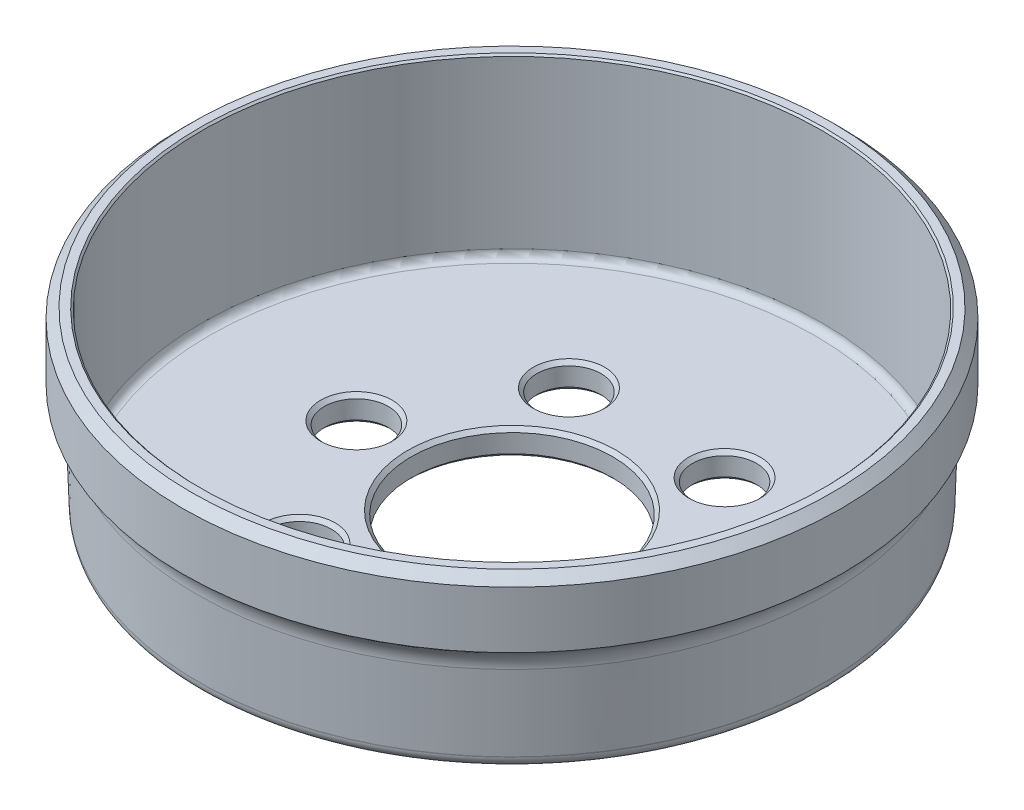
ISO-10303-21;
HEADER;
FILE_DESCRIPTION(('STEP AP214'),'2;1');
FILE_NAME('part.step','',(''),(''),'','','');
FILE_SCHEMA(('AUTOMOTIVE_DESIGN { 1 0 10303 214 1 1 1 1 }'));
ENDSEC;
DATA;
#1=APPLICATION_CONTEXT('core data for automotive mechanical design processes');
#2=APPLICATION_PROTOCOL_DEFINITION('international standard','automotive_design',2000,#1);
#3=PRODUCT_CONTEXT('',#1,'mechanical');
#4=PRODUCT('Part','Part','',(#3));
#5=PRODUCT_RELATED_PRODUCT_CATEGORY('part','',(#4));
#6=PRODUCT_DEFINITION_FORMATION('','',#4);
#7=PRODUCT_DEFINITION_CONTEXT('part definition',#1,'design');
#8=PRODUCT_DEFINITION('design','',#6,#7);
#9=PRODUCT_DEFINITION_SHAPE('','',#8);
#10=(LENGTH_UNIT() NAMED_UNIT(*) SI_UNIT(.MILLI.,.METRE.));
#11=(NAMED_UNIT(*) PLANE_ANGLE_UNIT() SI_UNIT($,.RADIAN.));
#12=(NAMED_UNIT(*) SI_UNIT($,.STERADIAN.) SOLID_ANGLE_UNIT());
#13=UNCERTAINTY_MEASURE_WITH_UNIT(LENGTH_MEASURE(1.E-05),#10,'distance_accuracy_value','');
#14=(GEOMETRIC_REPRESENTATION_CONTEXT(3) GLOBAL_UNCERTAINTY_ASSIGNED_CONTEXT((#13)) GLOBAL_UNIT_ASSIGNED_CONTEXT((#10,
#11,#12)) REPRESENTATION_CONTEXT('',''));
#15=CARTESIAN_POINT('',(0.,0.,0.));
#16=DIRECTION('',(0.,0.,1.));
#17=DIRECTION('',(1.,0.,0.));
#18=AXIS2_PLACEMENT_3D('',#15,#16,#17);
#19=CARTESIAN_POINT('',(0.,0.,0.));
#20=DIRECTION('',(0.,-1.,0.));
#21=DIRECTION('',(0.,0.,-1.));
#22=AXIS2_PLACEMENT_3D('',#19,#20,#21);
#23=CYLINDRICAL_SURFACE('',#22,16.948);
#24=CARTESIAN_POINT('',(0.,-0.1,0.));
#25=DIRECTION('',(0.,-1.,0.));
#26=DIRECTION('',(0.,0.,-1.));
#27=AXIS2_PLACEMENT_3D('',#24,#25,#26);
#28=CIRCLE('',#27,16.948);
#29=CARTESIAN_POINT('',(0.,-0.1,-16.948));
#30=VERTEX_POINT('',#29);
#31=EDGE_CURVE('E28',#30,#30,#28,.T.);
#32=ORIENTED_EDGE('',*,*,#31,.F.);
#33=EDGE_LOOP('',(#32));
#34=FACE_BOUND('',#33,.T.);
#35=CARTESIAN_POINT('',(0.,-9.2,0.));
#36=DIRECTION('',(0.,-1.,0.));
#37=DIRECTION('',(0.,0.,-1.));
#38=AXIS2_PLACEMENT_3D('',#35,#36,#37);
#39=CIRCLE('',#38,16.948);
#40=CARTESIAN_POINT('',(0.,-9.2,-16.948));
#41=VERTEX_POINT('',#40);
#42=EDGE_CURVE('E11',#41,#41,#39,.T.);
#43=ORIENTED_EDGE('',*,*,#42,.T.);
#44=EDGE_LOOP('',(#43));
#45=FACE_BOUND('',#44,.T.);
#46=ADVANCED_FACE('F17',(#34,#45),#23,.F.);
#47=CARTESIAN_POINT('',(0.,-0.1,0.));
#48=DIRECTION('',(0.,1.,0.));
#49=DIRECTION('',(0.,0.,1.));
#50=AXIS2_PLACEMENT_3D('',#47,#48,#49);
#51=CONICAL_SURFACE('',#50,16.948,0.785398163397448);
#52=CARTESIAN_POINT('',(0.,0.,0.));
#53=DIRECTION('',(0.,-1.,0.));
#54=DIRECTION('',(0.,0.,-1.));
#55=AXIS2_PLACEMENT_3D('',#52,#53,#54);
#56=CIRCLE('',#55,17.048);
#57=CARTESIAN_POINT('',(0.,0.,-17.048));
#58=VERTEX_POINT('',#57);
#59=EDGE_CURVE('E324',#58,#58,#56,.T.);
#60=ORIENTED_EDGE('',*,*,#59,.F.);
#61=EDGE_LOOP('',(#60));
#62=FACE_BOUND('',#61,.T.);
#63=ORIENTED_EDGE('',*,*,#31,.T.);
#64=EDGE_LOOP('',(#63));
#65=FACE_BOUND('',#64,.T.);
#66=ADVANCED_FACE('F331',(#62,#65),#51,.F.);
#67=CARTESIAN_POINT('',(17.048,0.,0.));
#68=DIRECTION('',(0.,-1.,0.));
#69=DIRECTION('',(0.,0.,-1.));
#70=AXIS2_PLACEMENT_3D('',#67,#68,#69);
#71=PLANE('',#70);
#72=CARTESIAN_POINT('',(0.,0.,0.));
#73=DIRECTION('',(0.,-1.,0.));
#74=DIRECTION('',(0.,0.,-1.));
#75=AXIS2_PLACEMENT_3D('',#72,#73,#74);
#76=CIRCLE('',#75,17.5);
#77=CARTESIAN_POINT('',(0.,0.,-17.5));
#78=VERTEX_POINT('',#77);
#79=EDGE_CURVE('E320',#78,#78,#76,.T.);
#80=ORIENTED_EDGE('',*,*,#79,.F.);
#81=EDGE_LOOP('',(#80));
#82=FACE_BOUND('',#81,.T.);
#83=ORIENTED_EDGE('',*,*,#59,.T.);
#84=EDGE_LOOP('',(#83));
#85=FACE_BOUND('',#84,.T.);
#86=ADVANCED_FACE('F333',(#82,#85),#71,.F.);
#87=CARTESIAN_POINT('',(0.,0.,0.));
#88=DIRECTION('',(0.,-1.,0.));
#89=DIRECTION('',(0.,0.,-1.));
#90=AXIS2_PLACEMENT_3D('',#87,#88,#89);
#91=CONICAL_SURFACE('',#90,17.5,0.785398163397442);
#92=CARTESIAN_POINT('',(0.,-0.5,0.));
#93=DIRECTION('',(0.,-1.,0.));
#94=DIRECTION('',(0.,0.,-1.));
#95=AXIS2_PLACEMENT_3D('',#92,#93,#94);
#96=CIRCLE('',#95,18.);
#97=CARTESIAN_POINT('',(0.,-0.5,-18.));
#98=VERTEX_POINT('',#97);
#99=EDGE_CURVE('E316',#98,#98,#96,.T.);
#100=ORIENTED_EDGE('',*,*,#99,.F.);
#101=EDGE_LOOP('',(#100));
#102=FACE_BOUND('',#101,.T.);
#103=ORIENTED_EDGE('',*,*,#79,.T.);
#104=EDGE_LOOP('',(#103));
#105=FACE_BOUND('',#104,.T.);
#106=ADVANCED_FACE('F341',(#102,#105),#91,.T.);
#107=CARTESIAN_POINT('',(0.,0.,0.));
#108=DIRECTION('',(0.,-1.,0.));
#109=DIRECTION('',(0.,0.,-1.));
#110=AXIS2_PLACEMENT_3D('',#107,#108,#109);
#111=CYLINDRICAL_SURFACE('',#110,18.);
#112=CARTESIAN_POINT('',(0.,-3.6,0.));
#113=DIRECTION('',(0.,-1.,0.));
#114=DIRECTION('',(0.,0.,-1.));
#115=AXIS2_PLACEMENT_3D('',#112,#113,#114);
#116=CIRCLE('',#115,18.);
#117=CARTESIAN_POINT('',(0.,-3.6,-18.));
#118=VERTEX_POINT('',#117);
#119=EDGE_CURVE('E312',#118,#118,#116,.T.);
#120=ORIENTED_EDGE('',*,*,#119,.F.);
#121=EDGE_LOOP('',(#120));
#122=FACE_BOUND('',#121,.T.);
#123=ORIENTED_EDGE('',*,*,#99,.T.);
#124=EDGE_LOOP('',(#123));
#125=FACE_BOUND('',#124,.T.);
#126=ADVANCED_FACE('F348',(#122,#125),#111,.T.);
#127=CARTESIAN_POINT('',(0.,-4.89961620758618,0.));
#128=DIRECTION('',(0.,-1.,0.));
#129=DIRECTION('',(0.,0.,-1.));
#130=AXIS2_PLACEMENT_3D('',#127,#128,#129);
#131=TOROIDAL_SURFACE('',#130,18.748997805724,1.5);
#132=CARTESIAN_POINT('',(0.,-4.92553676793566,0.));
#133=DIRECTION('',(0.,-1.,0.));
#134=DIRECTION('',(0.,0.,-1.));
#135=AXIS2_PLACEMENT_3D('',#132,#133,#134);
#136=CIRCLE('',#135,17.2492217809285);
#137=CARTESIAN_POINT('',(0.,-4.92553676793566,-17.2492217809285));
#138=VERTEX_POINT('',#137);
#139=EDGE_CURVE('E308',#138,#138,#136,.T.);
#140=ORIENTED_EDGE('',*,*,#139,.F.);
#141=EDGE_LOOP('',(#140));
#142=FACE_BOUND('',#141,.T.);
#143=ORIENTED_EDGE('',*,*,#119,.T.);
#144=EDGE_LOOP('',(#143));
#145=FACE_BOUND('',#144,.T.);
#146=ADVANCED_FACE('F352',(#142,#145),#131,.F.);
#147=CARTESIAN_POINT('',(0.,-4.92553676793566,0.));
#148=DIRECTION('',(0.,1.,0.));
#149=DIRECTION('',(0.,0.,1.));
#150=AXIS2_PLACEMENT_3D('',#147,#148,#149);
#151=CONICAL_SURFACE('',#150,17.2492217809285,0.0333329175489645);
#152=CARTESIAN_POINT('',(0.,-9.16053288232279,0.));
#153=DIRECTION('',(0.,-1.,0.));
#154=DIRECTION('',(0.,0.,-1.));
#155=AXIS2_PLACEMENT_3D('',#152,#153,#154);
#156=CIRCLE('',#155,17.108004699435);
#157=CARTESIAN_POINT('',(0.,-9.16053288232279,-17.108004699435));
#158=VERTEX_POINT('',#157);
#159=EDGE_CURVE('E304',#158,#158,#156,.T.);
#160=ORIENTED_EDGE('',*,*,#159,.F.);
#161=EDGE_LOOP('',(#160));
#162=FACE_BOUND('',#161,.T.);
#163=ORIENTED_EDGE('',*,*,#139,.T.);
#164=EDGE_LOOP('',(#163));
#165=FACE_BOUND('',#164,.T.);
#166=ADVANCED_FACE('F356',(#162,#165),#151,.T.);
#167=CARTESIAN_POINT('',(0.,0.,0.));
#168=DIRECTION('',(0.,-1.,0.));
#169=DIRECTION('',(0.,0.,-1.));
#170=AXIS2_PLACEMENT_3D('',#167,#168,#169);
#171=CYLINDRICAL_SURFACE('',#170,17.108004699435);
#172=CARTESIAN_POINT('',(0.,-9.18,0.));
#173=DIRECTION('',(0.,-1.,0.));
#174=DIRECTION('',(0.,0.,-1.));
#175=AXIS2_PLACEMENT_3D('',#172,#173,#174);
#176=CIRCLE('',#175,17.108004699435);
#177=CARTESIAN_POINT('',(0.,-9.18,-17.108004699435));
#178=VERTEX_POINT('',#177);
#179=EDGE_CURVE('E300',#178,#178,#176,.T.);
#180=ORIENTED_EDGE('',*,*,#179,.F.);
#181=EDGE_LOOP('',(#180));
#182=FACE_BOUND('',#181,.T.);
#183=ORIENTED_EDGE('',*,*,#159,.T.);
#184=EDGE_LOOP('',(#183));
#185=FACE_BOUND('',#184,.T.);
#186=ADVANCED_FACE('F360',(#182,#185),#171,.T.);
#187=CARTESIAN_POINT('',(0.,-9.18,0.));
#188=DIRECTION('',(0.,-1.,0.));
#189=DIRECTION('',(0.,0.,-1.));
#190=AXIS2_PLACEMENT_3D('',#187,#188,#189);
#191=TOROIDAL_SURFACE('',#190,16.508004699435,0.6);
#192=CARTESIAN_POINT('',(0.,-9.77913544998665,0.));
#193=DIRECTION('',(0.,-1.,0.));
#194=DIRECTION('',(0.,0.,-1.));
#195=AXIS2_PLACEMENT_3D('',#192,#193,#194);
#196=CIRCLE('',#195,16.5402027206363);
#197=CARTESIAN_POINT('',(0.,-9.77913544998665,-16.5402027206363));
#198=VERTEX_POINT('',#197);
#199=EDGE_CURVE('E296',#198,#198,#196,.T.);
#200=ORIENTED_EDGE('',*,*,#199,.F.);
#201=EDGE_LOOP('',(#200));
#202=FACE_BOUND('',#201,.T.);
#203=ORIENTED_EDGE('',*,*,#179,.T.);
#204=EDGE_LOOP('',(#203));
#205=FACE_BOUND('',#204,.T.);
#206=ADVANCED_FACE('F364',(#202,#205),#191,.T.);
#207=CARTESIAN_POINT('',(0.,-9.77913544998665,0.));
#208=DIRECTION('',(0.,1.,0.));
#209=DIRECTION('',(0.,0.,1.));
#210=AXIS2_PLACEMENT_3D('',#207,#208,#209);
#211=CONICAL_SURFACE('',#210,16.5402027206363,1.51710716844671);
#212=CARTESIAN_POINT('',(0.,-10.0398286215847,0.));
#213=DIRECTION('',(0.,-1.,0.));
#214=DIRECTION('',(0.,0.,-1.));
#215=AXIS2_PLACEMENT_3D('',#212,#213,#214);
#216=CIRCLE('',#215,11.6892673262663);
#217=CARTESIAN_POINT('',(0.,-10.0398286215847,-11.6892673262663));
#218=VERTEX_POINT('',#217);
#219=EDGE_CURVE('E292',#218,#218,#216,.T.);
#220=ORIENTED_EDGE('',*,*,#219,.F.);
#221=EDGE_LOOP('',(#220));
#222=FACE_BOUND('',#221,.T.);
#223=ORIENTED_EDGE('',*,*,#199,.T.);
#224=EDGE_LOOP('',(#223));
#225=FACE_BOUND('',#224,.T.);
#226=ADVANCED_FACE('F368',(#222,#225),#211,.T.);
#227=CARTESIAN_POINT('',(0.,-10.2395404382469,0.));
#228=DIRECTION('',(0.,-1.,0.));
#229=DIRECTION('',(0.,0.,-1.));
#230=AXIS2_PLACEMENT_3D('',#227,#228,#229);
#231=TOROIDAL_SURFACE('',#230,11.7,0.2);
#232=CARTESIAN_POINT('',(0.,-10.2395404382469,0.));
#233=DIRECTION('',(0.,-1.,0.));
#234=DIRECTION('',(0.,0.,-1.));
#235=AXIS2_PLACEMENT_3D('',#232,#233,#234);
#236=CIRCLE('',#235,11.5);
#237=CARTESIAN_POINT('',(0.,-10.2395404382469,-11.5));
#238=VERTEX_POINT('',#237);
#239=EDGE_CURVE('E288',#238,#238,#236,.T.);
#240=ORIENTED_EDGE('',*,*,#239,.F.);
#241=EDGE_LOOP('',(#240));
#242=FACE_BOUND('',#241,.T.);
#243=ORIENTED_EDGE('',*,*,#219,.T.);
#244=EDGE_LOOP('',(#243));
#245=FACE_BOUND('',#244,.T.);
#246=ADVANCED_FACE('F372',(#242,#245),#231,.F.);
#247=CARTESIAN_POINT('',(0.,0.,0.));
#248=DIRECTION('',(0.,-1.,0.));
#249=DIRECTION('',(0.,0.,-1.));
#250=AXIS2_PLACEMENT_3D('',#247,#248,#249);
#251=CYLINDRICAL_SURFACE('',#250,11.5);
#252=CARTESIAN_POINT('',(0.,-10.8,0.));
#253=DIRECTION('',(0.,-1.,0.));
#254=DIRECTION('',(0.,0.,-1.));
#255=AXIS2_PLACEMENT_3D('',#252,#253,#254);
#256=CIRCLE('',#255,11.5);
#257=CARTESIAN_POINT('',(0.,-10.8,-11.5));
#258=VERTEX_POINT('',#257);
#259=EDGE_CURVE('E281',#258,#258,#256,.T.);
#260=ORIENTED_EDGE('',*,*,#259,.F.);
#261=EDGE_LOOP('',(#260));
#262=FACE_BOUND('',#261,.T.);
#263=ORIENTED_EDGE('',*,*,#239,.T.);
#264=EDGE_LOOP('',(#263));
#265=FACE_BOUND('',#264,.T.);
#266=ADVANCED_FACE('F376',(#262,#265),#251,.T.);
#267=CARTESIAN_POINT('',(0.,-10.8,0.));
#268=DIRECTION('',(0.,1.,0.));
#269=DIRECTION('',(0.,0.,1.));
#270=AXIS2_PLACEMENT_3D('',#267,#268,#269);
#271=CONICAL_SURFACE('',#270,11.5,0.785398163397448);
#272=CARTESIAN_POINT('',(0.,-11.,0.));
#273=DIRECTION('',(0.,-1.,0.));
#274=DIRECTION('',(0.,0.,-1.));
#275=AXIS2_PLACEMENT_3D('',#272,#273,#274);
#276=CIRCLE('',#275,11.3);
#277=CARTESIAN_POINT('',(0.,-11.,-11.3));
#278=VERTEX_POINT('',#277);
#279=EDGE_CURVE('E256',#278,#278,#276,.T.);
#280=ORIENTED_EDGE('',*,*,#279,.F.);
#281=EDGE_LOOP('',(#280));
#282=FACE_BOUND('',#281,.T.);
#283=ORIENTED_EDGE('',*,*,#259,.T.);
#284=EDGE_LOOP('',(#283));
#285=FACE_BOUND('',#284,.T.);
#286=ADVANCED_FACE('F380',(#282,#285),#271,.T.);
#287=CARTESIAN_POINT('',(11.3,-11.,0.));
#288=DIRECTION('',(0.,1.,0.));
#289=DIRECTION('',(0.,0.,1.));
#290=AXIS2_PLACEMENT_3D('',#287,#288,#289);
#291=PLANE('',#290);
#292=CARTESIAN_POINT('',(4.25,-11.,7.36121593216775));
#293=DIRECTION('',(0.,1.,0.));
#294=DIRECTION('',(0.,0.,1.));
#295=AXIS2_PLACEMENT_3D('',#292,#293,#294);
#296=CIRCLE('',#295,1.95);
#297=CARTESIAN_POINT('',(4.25,-11.,9.31121593216775));
#298=VERTEX_POINT('',#297);
#299=EDGE_CURVE('E277',#298,#298,#296,.T.);
#300=ORIENTED_EDGE('',*,*,#299,.T.);
#301=EDGE_LOOP('',(#300));
#302=FACE_BOUND('',#301,.T.);
#303=CARTESIAN_POINT('',(-4.25,-11.,7.36121593216772));
#304=DIRECTION('',(0.,1.,0.));
#305=DIRECTION('',(0.,0.,1.));
#306=AXIS2_PLACEMENT_3D('',#303,#304,#305);
#307=CIRCLE('',#306,1.95);
#308=CARTESIAN_POINT('',(-4.25,-11.,9.31121593216772));
#309=VERTEX_POINT('',#308);
#310=EDGE_CURVE('E273',#309,#309,#307,.T.);
#311=ORIENTED_EDGE('',*,*,#310,.T.);
#312=EDGE_LOOP('',(#311));
#313=FACE_BOUND('',#312,.T.);
#314=CARTESIAN_POINT('',(-8.5,-11.,0.));
#315=DIRECTION('',(0.,1.,0.));
#316=DIRECTION('',(0.,0.,1.));
#317=AXIS2_PLACEMENT_3D('',#314,#315,#316);
#318=CIRCLE('',#317,1.95);
#319=CARTESIAN_POINT('',(-8.5,-11.,1.95));
#320=VERTEX_POINT('',#319);
#321=EDGE_CURVE('E269',#320,#320,#318,.T.);
#322=ORIENTED_EDGE('',*,*,#321,.T.);
#323=EDGE_LOOP('',(#322));
#324=FACE_BOUND('',#323,.T.);
#325=CARTESIAN_POINT('',(-4.25,-11.,-7.36121593216773));
#326=DIRECTION('',(0.,1.,0.));
#327=DIRECTION('',(0.,0.,1.));
#328=AXIS2_PLACEMENT_3D('',#325,#326,#327);
#329=CIRCLE('',#328,1.95);
#330=CARTESIAN_POINT('',(-4.25,-11.,-5.41121593216773));
#331=VERTEX_POINT('',#330);
#332=EDGE_CURVE('E265',#331,#331,#329,.T.);
#333=ORIENTED_EDGE('',*,*,#332,.T.);
#334=EDGE_LOOP('',(#333));
#335=FACE_BOUND('',#334,.T.);
#336=CARTESIAN_POINT('',(4.25,-11.,-7.36121593216772));
#337=DIRECTION('',(0.,1.,0.));
#338=DIRECTION('',(0.,0.,1.));
#339=AXIS2_PLACEMENT_3D('',#336,#337,#338);
#340=CIRCLE('',#339,1.95);
#341=CARTESIAN_POINT('',(4.25,-11.,-5.41121593216772));
#342=VERTEX_POINT('',#341);
#343=EDGE_CURVE('E261',#342,#342,#340,.T.);
#344=ORIENTED_EDGE('',*,*,#343,.T.);
#345=EDGE_LOOP('',(#344));
#346=FACE_BOUND('',#345,.T.);
#347=CARTESIAN_POINT('',(8.5,-11.,0.));
#348=DIRECTION('',(0.,1.,0.));
#349=DIRECTION('',(0.,0.,1.));
#350=AXIS2_PLACEMENT_3D('',#347,#348,#349);
#351=CIRCLE('',#350,1.95);
#352=CARTESIAN_POINT('',(8.5,-11.,1.95));
#353=VERTEX_POINT('',#352);
#354=EDGE_CURVE('E257',#353,#353,#351,.T.);
#355=ORIENTED_EDGE('',*,*,#354,.T.);
#356=EDGE_LOOP('',(#355));
#357=FACE_BOUND('',#356,.T.);
#358=CARTESIAN_POINT('',(0.,-11.,0.));
#359=DIRECTION('',(0.,-1.,0.));
#360=DIRECTION('',(0.,0.,-1.));
#361=AXIS2_PLACEMENT_3D('',#358,#359,#360);
#362=CIRCLE('',#361,5.7);
#363=CARTESIAN_POINT('',(0.,-11.,-5.7));
#364=VERTEX_POINT('',#363);
#365=EDGE_CURVE('E252',#364,#364,#362,.T.);
#366=ORIENTED_EDGE('',*,*,#365,.F.);
#367=EDGE_LOOP('',(#366));
#368=FACE_BOUND('',#367,.T.);
#369=ORIENTED_EDGE('',*,*,#279,.T.);
#370=EDGE_LOOP('',(#369));
#371=FACE_BOUND('',#370,.T.);
#372=ADVANCED_FACE('F384',(#302,#313,#324,#335,#346,#357,#368,#371),#291,.F.);
#373=CARTESIAN_POINT('',(0.,-11.,0.));
#374=DIRECTION('',(0.,-1.,0.));
#375=DIRECTION('',(0.,0.,-1.));
#376=AXIS2_PLACEMENT_3D('',#373,#374,#375);
#377=CONICAL_SURFACE('',#376,5.7,0.78539816339745);
#378=CARTESIAN_POINT('',(0.,-10.8,0.));
#379=DIRECTION('',(0.,-1.,0.));
#380=DIRECTION('',(0.,0.,-1.));
#381=AXIS2_PLACEMENT_3D('',#378,#379,#380);
#382=CIRCLE('',#381,5.5);
#383=CARTESIAN_POINT('',(0.,-10.8,-5.5));
#384=VERTEX_POINT('',#383);
#385=EDGE_CURVE('E248',#384,#384,#382,.T.);
#386=ORIENTED_EDGE('',*,*,#385,.F.);
#387=EDGE_LOOP('',(#386));
#388=FACE_BOUND('',#387,.T.);
#389=ORIENTED_EDGE('',*,*,#365,.T.);
#390=EDGE_LOOP('',(#389));
#391=FACE_BOUND('',#390,.T.);
#392=ADVANCED_FACE('F388',(#388,#391),#377,.F.);
#393=CARTESIAN_POINT('',(0.,0.,0.));
#394=DIRECTION('',(0.,-1.,0.));
#395=DIRECTION('',(0.,0.,-1.));
#396=AXIS2_PLACEMENT_3D('',#393,#394,#395);
#397=CYLINDRICAL_SURFACE('',#396,5.5);
#398=CARTESIAN_POINT('',(0.,-9.8,0.));
#399=DIRECTION('',(0.,-1.,0.));
#400=DIRECTION('',(0.,0.,-1.));
#401=AXIS2_PLACEMENT_3D('',#398,#399,#400);
#402=CIRCLE('',#401,5.5);
#403=CARTESIAN_POINT('',(0.,-9.8,-5.5));
#404=VERTEX_POINT('',#403);
#405=EDGE_CURVE('E241',#404,#404,#402,.T.);
#406=ORIENTED_EDGE('',*,*,#405,.F.);
#407=EDGE_LOOP('',(#406));
#408=FACE_BOUND('',#407,.T.);
#409=ORIENTED_EDGE('',*,*,#385,.T.);
#410=EDGE_LOOP('',(#409));
#411=FACE_BOUND('',#410,.T.);
#412=ADVANCED_FACE('F392',(#408,#411),#397,.F.);
#413=CARTESIAN_POINT('',(0.,-9.8,0.));
#414=DIRECTION('',(0.,1.,0.));
#415=DIRECTION('',(0.,0.,1.));
#416=AXIS2_PLACEMENT_3D('',#413,#414,#415);
#417=CONICAL_SURFACE('',#416,5.5,0.78539816339745);
#418=CARTESIAN_POINT('',(0.,-9.6,0.));
#419=DIRECTION('',(0.,-1.,0.));
#420=DIRECTION('',(0.,0.,-1.));
#421=AXIS2_PLACEMENT_3D('',#418,#419,#420);
#422=CIRCLE('',#421,5.7);
#423=CARTESIAN_POINT('',(0.,-9.6,-5.7));
#424=VERTEX_POINT('',#423);
#425=EDGE_CURVE('E216',#424,#424,#422,.T.);
#426=ORIENTED_EDGE('',*,*,#425,.F.);
#427=EDGE_LOOP('',(#426));
#428=FACE_BOUND('',#427,.T.);
#429=ORIENTED_EDGE('',*,*,#405,.T.);
#430=EDGE_LOOP('',(#429));
#431=FACE_BOUND('',#430,.T.);
#432=ADVANCED_FACE('F396',(#428,#431),#417,.F.);
#433=CARTESIAN_POINT('',(5.7,-9.6,0.));
#434=DIRECTION('',(0.,-1.,0.));
#435=DIRECTION('',(0.,0.,-1.));
#436=AXIS2_PLACEMENT_3D('',#433,#434,#435);
#437=PLANE('',#436);
#438=CARTESIAN_POINT('',(4.25,-9.6,7.36121593216775));
#439=DIRECTION('',(0.,-1.,0.));
#440=DIRECTION('',(0.,0.,-1.));
#441=AXIS2_PLACEMENT_3D('',#438,#439,#440);
#442=CIRCLE('',#441,1.95);
#443=CARTESIAN_POINT('',(4.25,-9.6,5.41121593216775));
#444=VERTEX_POINT('',#443);
#445=EDGE_CURVE('E237',#444,#444,#442,.T.);
#446=ORIENTED_EDGE('',*,*,#445,.T.);
#447=EDGE_LOOP('',(#446));
#448=FACE_BOUND('',#447,.T.);
#449=CARTESIAN_POINT('',(-4.25,-9.6,7.36121593216772));
#450=DIRECTION('',(0.,-1.,0.));
#451=DIRECTION('',(0.,0.,-1.));
#452=AXIS2_PLACEMENT_3D('',#449,#450,#451);
#453=CIRCLE('',#452,1.95);
#454=CARTESIAN_POINT('',(-4.25,-9.6,5.41121593216772));
#455=VERTEX_POINT('',#454);
#456=EDGE_CURVE('E233',#455,#455,#453,.T.);
#457=ORIENTED_EDGE('',*,*,#456,.T.);
#458=EDGE_LOOP('',(#457));
#459=FACE_BOUND('',#458,.T.);
#460=CARTESIAN_POINT('',(-8.5,-9.6,0.));
#461=DIRECTION('',(0.,-1.,0.));
#462=DIRECTION('',(0.,0.,-1.));
#463=AXIS2_PLACEMENT_3D('',#460,#461,#462);
#464=CIRCLE('',#463,1.95);
#465=CARTESIAN_POINT('',(-8.5,-9.6,-1.95));
#466=VERTEX_POINT('',#465);
#467=EDGE_CURVE('E229',#466,#466,#464,.T.);
#468=ORIENTED_EDGE('',*,*,#467,.T.);
#469=EDGE_LOOP('',(#468));
#470=FACE_BOUND('',#469,.T.);
#471=CARTESIAN_POINT('',(-4.25,-9.6,-7.36121593216773));
#472=DIRECTION('',(0.,-1.,0.));
#473=DIRECTION('',(0.,0.,-1.));
#474=AXIS2_PLACEMENT_3D('',#471,#472,#473);
#475=CIRCLE('',#474,1.95);
#476=CARTESIAN_POINT('',(-4.25,-9.6,-9.31121593216773));
#477=VERTEX_POINT('',#476);
#478=EDGE_CURVE('E225',#477,#477,#475,.T.);
#479=ORIENTED_EDGE('',*,*,#478,.T.);
#480=EDGE_LOOP('',(#479));
#481=FACE_BOUND('',#480,.T.);
#482=CARTESIAN_POINT('',(4.25,-9.6,-7.36121593216772));
#483=DIRECTION('',(0.,-1.,0.));
#484=DIRECTION('',(0.,0.,-1.));
#485=AXIS2_PLACEMENT_3D('',#482,#483,#484);
#486=CIRCLE('',#485,1.95);
#487=CARTESIAN_POINT('',(4.25,-9.6,-9.31121593216772));
#488=VERTEX_POINT('',#487);
#489=EDGE_CURVE('E221',#488,#488,#486,.T.);
#490=ORIENTED_EDGE('',*,*,#489,.T.);
#491=EDGE_LOOP('',(#490));
#492=FACE_BOUND('',#491,.T.);
#493=CARTESIAN_POINT('',(8.5,-9.6,0.));
#494=DIRECTION('',(0.,-1.,0.));
#495=DIRECTION('',(0.,0.,-1.));
#496=AXIS2_PLACEMENT_3D('',#493,#494,#495);
#497=CIRCLE('',#496,1.95);
#498=CARTESIAN_POINT('',(8.5,-9.6,-1.95));
#499=VERTEX_POINT('',#498);
#500=EDGE_CURVE('E217',#499,#499,#497,.T.);
#501=ORIENTED_EDGE('',*,*,#500,.T.);
#502=EDGE_LOOP('',(#501));
#503=FACE_BOUND('',#502,.T.);
#504=CARTESIAN_POINT('',(0.,-9.6,0.));
#505=DIRECTION('',(0.,-1.,0.));
#506=DIRECTION('',(0.,0.,-1.));
#507=AXIS2_PLACEMENT_3D('',#504,#505,#506);
#508=CIRCLE('',#507,16.548);
#509=CARTESIAN_POINT('',(0.,-9.6,-16.548));
#510=VERTEX_POINT('',#509);
#511=EDGE_CURVE('E212',#510,#510,#508,.T.);
#512=ORIENTED_EDGE('',*,*,#511,.F.);
#513=EDGE_LOOP('',(#512));
#514=FACE_BOUND('',#513,.T.);
#515=ORIENTED_EDGE('',*,*,#425,.T.);
#516=EDGE_LOOP('',(#515));
#517=FACE_BOUND('',#516,.T.);
#518=ADVANCED_FACE('F400',(#448,#459,#470,#481,#492,#503,#514,#517),#437,.F.);
#519=CARTESIAN_POINT('',(0.,-9.2,0.));
#520=DIRECTION('',(0.,-1.,0.));
#521=DIRECTION('',(0.,0.,-1.));
#522=AXIS2_PLACEMENT_3D('',#519,#520,#521);
#523=TOROIDAL_SURFACE('',#522,16.548,0.4);
#524=ORIENTED_EDGE('',*,*,#42,.F.);
#525=EDGE_LOOP('',(#524));
#526=FACE_BOUND('',#525,.T.);
#527=ORIENTED_EDGE('',*,*,#511,.T.);
#528=EDGE_LOOP('',(#527));
#529=FACE_BOUND('',#528,.T.);
#530=ADVANCED_FACE('F404',(#526,#529),#523,.F.);
#531=CARTESIAN_POINT('',(8.5,-11.,0.));
#532=DIRECTION('',(0.,1.,0.));
#533=DIRECTION('',(0.,0.,1.));
#534=AXIS2_PLACEMENT_3D('',#531,#532,#533);
#535=CYLINDRICAL_SURFACE('',#534,1.75);
#536=CARTESIAN_POINT('',(8.5,-9.8,0.));
#537=DIRECTION('',(0.,1.,0.));
#538=DIRECTION('',(0.,0.,-1.));
#539=AXIS2_PLACEMENT_3D('',#536,#537,#538);
#540=CIRCLE('',#539,1.75);
#541=CARTESIAN_POINT('',(8.5,-9.8,-1.75));
#542=VERTEX_POINT('',#541);
#543=EDGE_CURVE('E208',#542,#542,#540,.T.);
#544=ORIENTED_EDGE('',*,*,#543,.T.);
#545=EDGE_LOOP('',(#544));
#546=FACE_BOUND('',#545,.T.);
#547=CARTESIAN_POINT('',(8.5,-10.8,0.));
#548=DIRECTION('',(0.,-1.,0.));
#549=DIRECTION('',(0.,0.,1.));
#550=AXIS2_PLACEMENT_3D('',#547,#548,#549);
#551=CIRCLE('',#550,1.75);
#552=CARTESIAN_POINT('',(8.5,-10.8,1.75));
#553=VERTEX_POINT('',#552);
#554=EDGE_CURVE('E204',#553,#553,#551,.T.);
#555=ORIENTED_EDGE('',*,*,#554,.T.);
#556=EDGE_LOOP('',(#555));
#557=FACE_BOUND('',#556,.T.);
#558=ADVANCED_FACE('F408',(#546,#557),#535,.F.);
#559=CARTESIAN_POINT('',(8.5,-9.6,0.));
#560=DIRECTION('',(0.,1.,0.));
#561=DIRECTION('',(0.,0.,1.));
#562=AXIS2_PLACEMENT_3D('',#559,#560,#561);
#563=CONICAL_SURFACE('',#562,1.95,0.785398163397448);
#564=ORIENTED_EDGE('',*,*,#543,.F.);
#565=EDGE_LOOP('',(#564));
#566=FACE_BOUND('',#565,.T.);
#567=ORIENTED_EDGE('',*,*,#500,.F.);
#568=EDGE_LOOP('',(#567));
#569=FACE_BOUND('',#568,.T.);
#570=ADVANCED_FACE('F412',(#566,#569),#563,.F.);
#571=CARTESIAN_POINT('',(8.5,-11.,0.));
#572=DIRECTION('',(0.,-1.,0.));
#573=DIRECTION('',(0.,0.,-1.));
#574=AXIS2_PLACEMENT_3D('',#571,#572,#573);
#575=CONICAL_SURFACE('',#574,1.95,0.785398163397448);
#576=ORIENTED_EDGE('',*,*,#554,.F.);
#577=EDGE_LOOP('',(#576));
#578=FACE_BOUND('',#577,.T.);
#579=ORIENTED_EDGE('',*,*,#354,.F.);
#580=EDGE_LOOP('',(#579));
#581=FACE_BOUND('',#580,.T.);
#582=ADVANCED_FACE('F416',(#578,#581),#575,.F.);
#583=CARTESIAN_POINT('',(4.25,-11.,-7.36121593216772));
#584=DIRECTION('',(0.,1.,0.));
#585=DIRECTION('',(0.,0.,1.));
#586=AXIS2_PLACEMENT_3D('',#583,#584,#585);
#587=CYLINDRICAL_SURFACE('',#586,1.75);
#588=CARTESIAN_POINT('',(4.25,-9.8,-7.36121593216772));
#589=DIRECTION('',(0.,1.,0.));
#590=DIRECTION('',(0.,0.,-1.));
#591=AXIS2_PLACEMENT_3D('',#588,#589,#590);
#592=CIRCLE('',#591,1.75);
#593=CARTESIAN_POINT('',(4.25,-9.8,-9.11121593216772));
#594=VERTEX_POINT('',#593);
#595=EDGE_CURVE('E200',#594,#594,#592,.T.);
#596=ORIENTED_EDGE('',*,*,#595,.T.);
#597=EDGE_LOOP('',(#596));
#598=FACE_BOUND('',#597,.T.);
#599=CARTESIAN_POINT('',(4.25,-10.8,-7.36121593216772));
#600=DIRECTION('',(0.,-1.,0.));
#601=DIRECTION('',(0.,0.,1.));
#602=AXIS2_PLACEMENT_3D('',#599,#600,#601);
#603=CIRCLE('',#602,1.75);
#604=CARTESIAN_POINT('',(4.25,-10.8,-5.61121593216772));
#605=VERTEX_POINT('',#604);
#606=EDGE_CURVE('E196',#605,#605,#603,.T.);
#607=ORIENTED_EDGE('',*,*,#606,.T.);
#608=EDGE_LOOP('',(#607));
#609=FACE_BOUND('',#608,.T.);
#610=ADVANCED_FACE('F420',(#598,#609),#587,.F.);
#611=CARTESIAN_POINT('',(4.25,-9.6,-7.36121593216772));
#612=DIRECTION('',(0.,1.,0.));
#613=DIRECTION('',(0.,0.,1.));
#614=AXIS2_PLACEMENT_3D('',#611,#612,#613);
#615=CONICAL_SURFACE('',#614,1.95,0.785398163397448);
#616=ORIENTED_EDGE('',*,*,#595,.F.);
#617=EDGE_LOOP('',(#616));
#618=FACE_BOUND('',#617,.T.);
#619=ORIENTED_EDGE('',*,*,#489,.F.);
#620=EDGE_LOOP('',(#619));
#621=FACE_BOUND('',#620,.T.);
#622=ADVANCED_FACE('F424',(#618,#621),#615,.F.);
#623=CARTESIAN_POINT('',(4.25,-11.,-7.36121593216772));
#624=DIRECTION('',(0.,-1.,0.));
#625=DIRECTION('',(0.,0.,-1.));
#626=AXIS2_PLACEMENT_3D('',#623,#624,#625);
#627=CONICAL_SURFACE('',#626,1.95,0.785398163397448);
#628=ORIENTED_EDGE('',*,*,#606,.F.);
#629=EDGE_LOOP('',(#628));
#630=FACE_BOUND('',#629,.T.);
#631=ORIENTED_EDGE('',*,*,#343,.F.);
#632=EDGE_LOOP('',(#631));
#633=FACE_BOUND('',#632,.T.);
#634=ADVANCED_FACE('F428',(#630,#633),#627,.F.);
#635=CARTESIAN_POINT('',(-4.25,-11.,-7.36121593216773));
#636=DIRECTION('',(0.,1.,0.));
#637=DIRECTION('',(0.,0.,1.));
#638=AXIS2_PLACEMENT_3D('',#635,#636,#637);
#639=CYLINDRICAL_SURFACE('',#638,1.75);
#640=CARTESIAN_POINT('',(-4.25,-9.8,-7.36121593216773));
#641=DIRECTION('',(0.,1.,0.));
#642=DIRECTION('',(0.,0.,-1.));
#643=AXIS2_PLACEMENT_3D('',#640,#641,#642);
#644=CIRCLE('',#643,1.75);
#645=CARTESIAN_POINT('',(-4.25,-9.8,-9.11121593216773));
#646=VERTEX_POINT('',#645);
#647=EDGE_CURVE('E192',#646,#646,#644,.T.);
#648=ORIENTED_EDGE('',*,*,#647,.T.);
#649=EDGE_LOOP('',(#648));
#650=FACE_BOUND('',#649,.T.);
#651=CARTESIAN_POINT('',(-4.25,-10.8,-7.36121593216773));
#652=DIRECTION('',(0.,-1.,0.));
#653=DIRECTION('',(0.,0.,1.));
#654=AXIS2_PLACEMENT_3D('',#651,#652,#653);
#655=CIRCLE('',#654,1.75);
#656=CARTESIAN_POINT('',(-4.25,-10.8,-5.61121593216773));
#657=VERTEX_POINT('',#656);
#658=EDGE_CURVE('E188',#657,#657,#655,.T.);
#659=ORIENTED_EDGE('',*,*,#658,.T.);
#660=EDGE_LOOP('',(#659));
#661=FACE_BOUND('',#660,.T.);
#662=ADVANCED_FACE('F432',(#650,#661),#639,.F.);
#663=CARTESIAN_POINT('',(-4.25,-9.6,-7.36121593216773));
#664=DIRECTION('',(0.,1.,0.));
#665=DIRECTION('',(0.,0.,1.));
#666=AXIS2_PLACEMENT_3D('',#663,#664,#665);
#667=CONICAL_SURFACE('',#666,1.95,0.785398163397448);
#668=ORIENTED_EDGE('',*,*,#647,.F.);
#669=EDGE_LOOP('',(#668));
#670=FACE_BOUND('',#669,.T.);
#671=ORIENTED_EDGE('',*,*,#478,.F.);
#672=EDGE_LOOP('',(#671));
#673=FACE_BOUND('',#672,.T.);
#674=ADVANCED_FACE('F436',(#670,#673),#667,.F.);
#675=CARTESIAN_POINT('',(-4.25,-11.,-7.36121593216773));
#676=DIRECTION('',(0.,-1.,0.));
#677=DIRECTION('',(0.,0.,-1.));
#678=AXIS2_PLACEMENT_3D('',#675,#676,#677);
#679=CONICAL_SURFACE('',#678,1.95,0.785398163397446);
#680=ORIENTED_EDGE('',*,*,#658,.F.);
#681=EDGE_LOOP('',(#680));
#682=FACE_BOUND('',#681,.T.);
#683=ORIENTED_EDGE('',*,*,#332,.F.);
#684=EDGE_LOOP('',(#683));
#685=FACE_BOUND('',#684,.T.);
#686=ADVANCED_FACE('F440',(#682,#685),#679,.F.);
#687=CARTESIAN_POINT('',(-8.5,-11.,0.));
#688=DIRECTION('',(0.,1.,0.));
#689=DIRECTION('',(0.,0.,1.));
#690=AXIS2_PLACEMENT_3D('',#687,#688,#689);
#691=CYLINDRICAL_SURFACE('',#690,1.75);
#692=CARTESIAN_POINT('',(-8.5,-9.8,0.));
#693=DIRECTION('',(0.,1.,0.));
#694=DIRECTION('',(0.,0.,-1.));
#695=AXIS2_PLACEMENT_3D('',#692,#693,#694);
#696=CIRCLE('',#695,1.75);
#697=CARTESIAN_POINT('',(-8.5,-9.8,-1.75));
#698=VERTEX_POINT('',#697);
#699=EDGE_CURVE('E184',#698,#698,#696,.T.);
#700=ORIENTED_EDGE('',*,*,#699,.T.);
#701=EDGE_LOOP('',(#700));
#702=FACE_BOUND('',#701,.T.);
#703=CARTESIAN_POINT('',(-8.5,-10.8,0.));
#704=DIRECTION('',(0.,-1.,0.));
#705=DIRECTION('',(0.,0.,1.));
#706=AXIS2_PLACEMENT_3D('',#703,#704,#705);
#707=CIRCLE('',#706,1.75);
#708=CARTESIAN_POINT('',(-8.5,-10.8,1.75));
#709=VERTEX_POINT('',#708);
#710=EDGE_CURVE('E180',#709,#709,#707,.T.);
#711=ORIENTED_EDGE('',*,*,#710,.T.);
#712=EDGE_LOOP('',(#711));
#713=FACE_BOUND('',#712,.T.);
#714=ADVANCED_FACE('F444',(#702,#713),#691,.F.);
#715=CARTESIAN_POINT('',(-8.5,-9.6,0.));
#716=DIRECTION('',(0.,1.,0.));
#717=DIRECTION('',(0.,0.,1.));
#718=AXIS2_PLACEMENT_3D('',#715,#716,#717);
#719=CONICAL_SURFACE('',#718,1.95,0.785398163397448);
#720=ORIENTED_EDGE('',*,*,#699,.F.);
#721=EDGE_LOOP('',(#720));
#722=FACE_BOUND('',#721,.T.);
#723=ORIENTED_EDGE('',*,*,#467,.F.);
#724=EDGE_LOOP('',(#723));
#725=FACE_BOUND('',#724,.T.);
#726=ADVANCED_FACE('F448',(#722,#725),#719,.F.);
#727=CARTESIAN_POINT('',(-8.5,-11.,0.));
#728=DIRECTION('',(0.,-1.,0.));
#729=DIRECTION('',(0.,0.,-1.));
#730=AXIS2_PLACEMENT_3D('',#727,#728,#729);
#731=CONICAL_SURFACE('',#730,1.95,0.785398163397448);
#732=ORIENTED_EDGE('',*,*,#710,.F.);
#733=EDGE_LOOP('',(#732));
#734=FACE_BOUND('',#733,.T.);
#735=ORIENTED_EDGE('',*,*,#321,.F.);
#736=EDGE_LOOP('',(#735));
#737=FACE_BOUND('',#736,.T.);
#738=ADVANCED_FACE('F452',(#734,#737),#731,.F.);
#739=CARTESIAN_POINT('',(-4.25,-11.,7.36121593216772));
#740=DIRECTION('',(0.,1.,0.));
#741=DIRECTION('',(0.,0.,1.));
#742=AXIS2_PLACEMENT_3D('',#739,#740,#741);
#743=CYLINDRICAL_SURFACE('',#742,1.75);
#744=CARTESIAN_POINT('',(-4.25,-9.8,7.36121593216772));
#745=DIRECTION('',(0.,1.,0.));
#746=DIRECTION('',(0.,0.,-1.));
#747=AXIS2_PLACEMENT_3D('',#744,#745,#746);
#748=CIRCLE('',#747,1.75);
#749=CARTESIAN_POINT('',(-4.25,-9.8,5.61121593216772));
#750=VERTEX_POINT('',#749);
#751=EDGE_CURVE('E174',#750,#750,#748,.T.);
#752=ORIENTED_EDGE('',*,*,#751,.T.);
#753=EDGE_LOOP('',(#752));
#754=FACE_BOUND('',#753,.T.);
#755=CARTESIAN_POINT('',(-4.25,-10.8,7.36121593216772));
#756=DIRECTION('',(0.,-1.,0.));
#757=DIRECTION('',(0.,0.,1.));
#758=AXIS2_PLACEMENT_3D('',#755,#756,#757);
#759=CIRCLE('',#758,1.75);
#760=CARTESIAN_POINT('',(-4.25,-10.8,9.11121593216772));
#761=VERTEX_POINT('',#760);
#762=EDGE_CURVE('E169',#761,#761,#759,.T.);
#763=ORIENTED_EDGE('',*,*,#762,.T.);
#764=EDGE_LOOP('',(#763));
#765=FACE_BOUND('',#764,.T.);
#766=ADVANCED_FACE('F456',(#754,#765),#743,.F.);
#767=CARTESIAN_POINT('',(-4.25,-9.6,7.36121593216772));
#768=DIRECTION('',(0.,1.,0.));
#769=DIRECTION('',(0.,0.,1.));
#770=AXIS2_PLACEMENT_3D('',#767,#768,#769);
#771=CONICAL_SURFACE('',#770,1.95,0.785398163397448);
#772=ORIENTED_EDGE('',*,*,#751,.F.);
#773=EDGE_LOOP('',(#772));
#774=FACE_BOUND('',#773,.T.);
#775=ORIENTED_EDGE('',*,*,#456,.F.);
#776=EDGE_LOOP('',(#775));
#777=FACE_BOUND('',#776,.T.);
#778=ADVANCED_FACE('F460',(#774,#777),#771,.F.);
#779=CARTESIAN_POINT('',(-4.25,-11.,7.36121593216772));
#780=DIRECTION('',(0.,-1.,0.));
#781=DIRECTION('',(0.,0.,-1.));
#782=AXIS2_PLACEMENT_3D('',#779,#780,#781);
#783=CONICAL_SURFACE('',#782,1.95,0.785398163397448);
#784=ORIENTED_EDGE('',*,*,#762,.F.);
#785=EDGE_LOOP('',(#784));
#786=FACE_BOUND('',#785,.T.);
#787=ORIENTED_EDGE('',*,*,#310,.F.);
#788=EDGE_LOOP('',(#787));
#789=FACE_BOUND('',#788,.T.);
#790=ADVANCED_FACE('F464',(#786,#789),#783,.F.);
#791=CARTESIAN_POINT('',(4.25,-11.,7.36121593216775));
#792=DIRECTION('',(0.,1.,0.));
#793=DIRECTION('',(0.,0.,1.));
#794=AXIS2_PLACEMENT_3D('',#791,#792,#793);
#795=CYLINDRICAL_SURFACE('',#794,1.75);
#796=CARTESIAN_POINT('',(4.25,-9.8,7.36121593216775));
#797=DIRECTION('',(0.,1.,0.));
#798=DIRECTION('',(0.,0.,-1.));
#799=AXIS2_PLACEMENT_3D('',#796,#797,#798);
#800=CIRCLE('',#799,1.75);
#801=CARTESIAN_POINT('',(4.25,-9.8,5.61121593216775));
#802=VERTEX_POINT('',#801);
#803=EDGE_CURVE('E158',#802,#802,#800,.T.);
#804=ORIENTED_EDGE('',*,*,#803,.T.);
#805=EDGE_LOOP('',(#804));
#806=FACE_BOUND('',#805,.T.);
#807=CARTESIAN_POINT('',(4.25,-10.8,7.36121593216775));
#808=DIRECTION('',(0.,-1.,0.));
#809=DIRECTION('',(0.,0.,1.));
#810=AXIS2_PLACEMENT_3D('',#807,#808,#809);
#811=CIRCLE('',#810,1.75);
#812=CARTESIAN_POINT('',(4.25,-10.8,9.11121593216775));
#813=VERTEX_POINT('',#812);
#814=EDGE_CURVE('E21',#813,#813,#811,.T.);
#815=ORIENTED_EDGE('',*,*,#814,.T.);
#816=EDGE_LOOP('',(#815));
#817=FACE_BOUND('',#816,.T.);
#818=ADVANCED_FACE('F468',(#806,#817),#795,.F.);
#819=CARTESIAN_POINT('',(4.25,-9.6,7.36121593216775));
#820=DIRECTION('',(0.,1.,0.));
#821=DIRECTION('',(0.,0.,1.));
#822=AXIS2_PLACEMENT_3D('',#819,#820,#821);
#823=CONICAL_SURFACE('',#822,1.95,0.785398163397448);
#824=ORIENTED_EDGE('',*,*,#803,.F.);
#825=EDGE_LOOP('',(#824));
#826=FACE_BOUND('',#825,.T.);
#827=ORIENTED_EDGE('',*,*,#445,.F.);
#828=EDGE_LOOP('',(#827));
#829=FACE_BOUND('',#828,.T.);
#830=ADVANCED_FACE('F471',(#826,#829),#823,.F.);
#831=CARTESIAN_POINT('',(4.25,-11.,7.36121593216775));
#832=DIRECTION('',(0.,-1.,0.));
#833=DIRECTION('',(0.,0.,-1.));
#834=AXIS2_PLACEMENT_3D('',#831,#832,#833);
#835=CONICAL_SURFACE('',#834,1.95,0.785398163397448);
#836=ORIENTED_EDGE('',*,*,#814,.F.);
#837=EDGE_LOOP('',(#836));
#838=FACE_BOUND('',#837,.T.);
#839=ORIENTED_EDGE('',*,*,#299,.F.);
#840=EDGE_LOOP('',(#839));
#841=FACE_BOUND('',#840,.T.);
#842=ADVANCED_FACE('F19',(#838,#841),#835,.F.);
#843=CLOSED_SHELL('',(#46,#66,#86,#106,#126,#146,#166,#186,#206,#226,#246,#266,#286,#372,#392,
#412,#432,#518,#530,#558,#570,#582,#610,#622,#634,#662,#674,#686,#714,#726,#738,#766,#778,#790,
#818,#830,#842));
#844=MANIFOLD_SOLID_BREP('B1',#843);
#845=ADVANCED_BREP_SHAPE_REPRESENTATION('',(#18,#844),#14);
#846=SHAPE_DEFINITION_REPRESENTATION(#9,#845);
ENDSEC;
END-ISO-10303-21;
